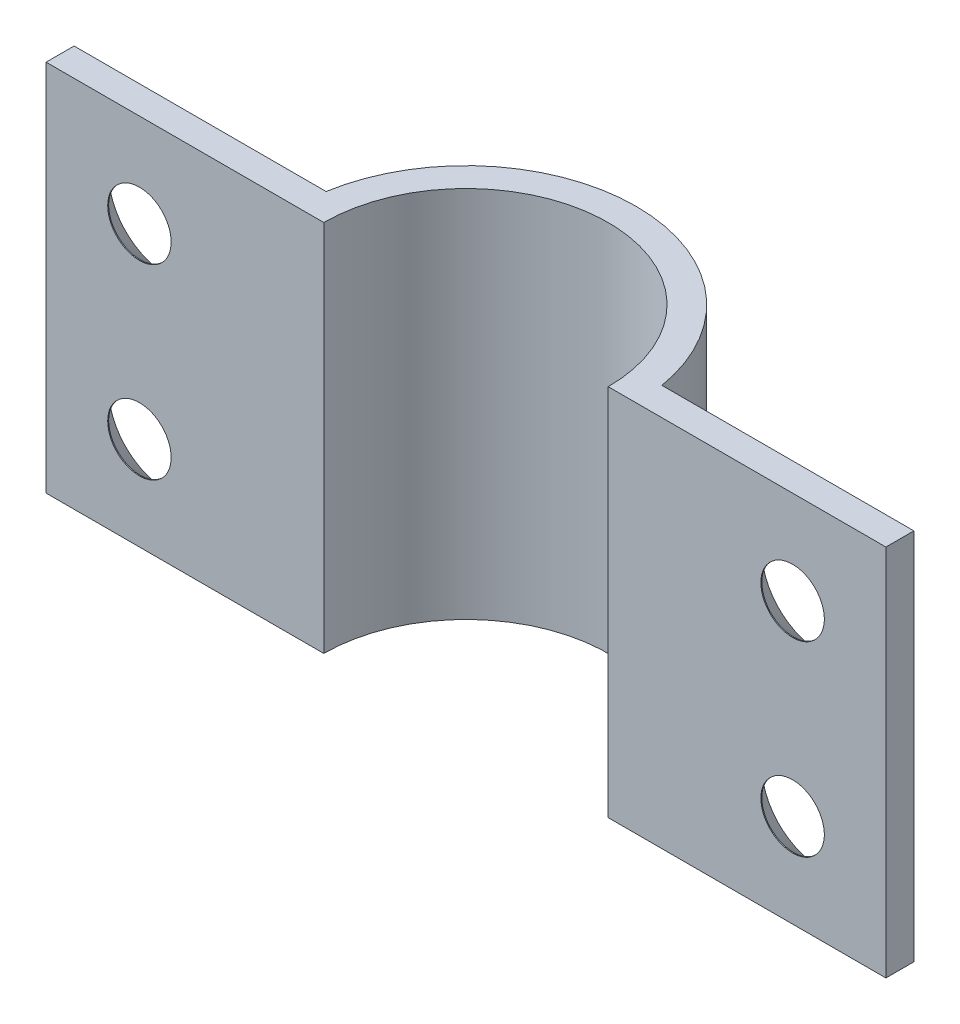
ISO-10303-21;
HEADER;
FILE_DESCRIPTION(('STEP AP214'),'2;1');
FILE_NAME('part.step','',(''),(''),'','','');
FILE_SCHEMA(('AUTOMOTIVE_DESIGN { 1 0 10303 214 1 1 1 1 }'));
ENDSEC;
DATA;
#1=APPLICATION_CONTEXT('core data for automotive mechanical design processes');
#2=APPLICATION_PROTOCOL_DEFINITION('international standard','automotive_design',2000,#1);
#3=PRODUCT_CONTEXT('',#1,'mechanical');
#4=PRODUCT('Part','Part','',(#3));
#5=PRODUCT_RELATED_PRODUCT_CATEGORY('part','',(#4));
#6=PRODUCT_DEFINITION_FORMATION('','',#4);
#7=PRODUCT_DEFINITION_CONTEXT('part definition',#1,'design');
#8=PRODUCT_DEFINITION('design','',#6,#7);
#9=PRODUCT_DEFINITION_SHAPE('','',#8);
#10=(LENGTH_UNIT() NAMED_UNIT(*) SI_UNIT(.MILLI.,.METRE.));
#11=(NAMED_UNIT(*) PLANE_ANGLE_UNIT() SI_UNIT($,.RADIAN.));
#12=(NAMED_UNIT(*) SI_UNIT($,.STERADIAN.) SOLID_ANGLE_UNIT());
#13=UNCERTAINTY_MEASURE_WITH_UNIT(LENGTH_MEASURE(1.E-05),#10,'distance_accuracy_value','');
#14=(GEOMETRIC_REPRESENTATION_CONTEXT(3) GLOBAL_UNCERTAINTY_ASSIGNED_CONTEXT((#13)) GLOBAL_UNIT_ASSIGNED_CONTEXT((#10,
#11,#12)) REPRESENTATION_CONTEXT('',''));
#15=CARTESIAN_POINT('',(0.,0.,0.));
#16=DIRECTION('',(0.,0.,1.));
#17=DIRECTION('',(1.,0.,0.));
#18=AXIS2_PLACEMENT_3D('',#15,#16,#17);
#19=CARTESIAN_POINT('',(0.,20.,0.));
#20=DIRECTION('',(0.,-1.,0.));
#21=DIRECTION('',(0.,0.,-1.));
#22=AXIS2_PLACEMENT_3D('',#19,#20,#21);
#23=CYLINDRICAL_SURFACE('',#22,9.12);
#24=CARTESIAN_POINT('',(0.,0.,0.));
#25=DIRECTION('',(0.,1.,0.));
#26=DIRECTION('',(0.,0.,1.));
#27=AXIS2_PLACEMENT_3D('',#24,#25,#26);
#28=CIRCLE('',#27,9.12);
#29=CARTESIAN_POINT('',(8.9957990195424,0.,-1.5));
#30=VERTEX_POINT('',#29);
#31=CARTESIAN_POINT('',(-8.9957990195424,0.,-1.5));
#32=VERTEX_POINT('',#31);
#33=EDGE_CURVE('E140',#30,#32,#28,.T.);
#34=ORIENTED_EDGE('',*,*,#33,.T.);
#35=DIRECTION('',(0.,-1.,0.));
#36=VECTOR('',#35,1.);
#37=CARTESIAN_POINT('',(-8.9957990195424,20.,-1.5));
#38=LINE('',#37,#36);
#39=CARTESIAN_POINT('',(-8.9957990195424,20.,-1.5));
#40=VERTEX_POINT('',#39);
#41=EDGE_CURVE('E11',#40,#32,#38,.T.);
#42=ORIENTED_EDGE('',*,*,#41,.F.);
#43=CARTESIAN_POINT('',(0.,20.,0.));
#44=DIRECTION('',(0.,1.,0.));
#45=DIRECTION('',(0.,0.,1.));
#46=AXIS2_PLACEMENT_3D('',#43,#44,#45);
#47=CIRCLE('',#46,9.12);
#48=CARTESIAN_POINT('',(8.9957990195424,20.,-1.5));
#49=VERTEX_POINT('',#48);
#50=EDGE_CURVE('E163',#49,#40,#47,.T.);
#51=ORIENTED_EDGE('',*,*,#50,.F.);
#52=DIRECTION('',(0.,-1.,0.));
#53=VECTOR('',#52,1.);
#54=CARTESIAN_POINT('',(8.9957990195424,20.,-1.5));
#55=LINE('',#54,#53);
#56=EDGE_CURVE('E136',#49,#30,#55,.T.);
#57=ORIENTED_EDGE('',*,*,#56,.T.);
#58=EDGE_LOOP('',(#34,#42,#51,#57));
#59=FACE_BOUND('',#58,.T.);
#60=ADVANCED_FACE('F39',(#59),#23,.T.);
#61=CARTESIAN_POINT('',(-8.9957990195424,20.,-1.5));
#62=DIRECTION('',(0.,0.,1.));
#63=DIRECTION('',(1.,0.,0.));
#64=AXIS2_PLACEMENT_3D('',#61,#62,#63);
#65=PLANE('',#64);
#66=CARTESIAN_POINT('',(-17.5,5.,-1.5));
#67=DIRECTION('',(0.,0.,-1.));
#68=DIRECTION('',(-1.,0.,0.));
#69=AXIS2_PLACEMENT_3D('',#66,#67,#68);
#70=CIRCLE('',#69,3.15);
#71=CARTESIAN_POINT('',(-20.65,5.,-1.5));
#72=VERTEX_POINT('',#71);
#73=EDGE_CURVE('E238',#72,#72,#70,.T.);
#74=ORIENTED_EDGE('',*,*,#73,.F.);
#75=EDGE_LOOP('',(#74));
#76=FACE_BOUND('',#75,.T.);
#77=CARTESIAN_POINT('',(-17.5,15.,-1.5));
#78=DIRECTION('',(0.,0.,-1.));
#79=DIRECTION('',(-1.,0.,0.));
#80=AXIS2_PLACEMENT_3D('',#77,#78,#79);
#81=CIRCLE('',#80,3.15);
#82=CARTESIAN_POINT('',(-20.65,15.,-1.5));
#83=VERTEX_POINT('',#82);
#84=EDGE_CURVE('E214',#83,#83,#81,.T.);
#85=ORIENTED_EDGE('',*,*,#84,.F.);
#86=EDGE_LOOP('',(#85));
#87=FACE_BOUND('',#86,.T.);
#88=DIRECTION('',(-1.,0.,0.));
#89=VECTOR('',#88,1.);
#90=CARTESIAN_POINT('',(-8.9957990195424,0.,-1.5));
#91=LINE('',#90,#89);
#92=CARTESIAN_POINT('',(-22.5,0.,-1.5));
#93=VERTEX_POINT('',#92);
#94=EDGE_CURVE('E144',#32,#93,#91,.T.);
#95=ORIENTED_EDGE('',*,*,#94,.T.);
#96=DIRECTION('',(0.,-1.,0.));
#97=VECTOR('',#96,1.);
#98=CARTESIAN_POINT('',(-22.5,20.,-1.5));
#99=LINE('',#98,#97);
#100=CARTESIAN_POINT('',(-22.5,20.,-1.5));
#101=VERTEX_POINT('',#100);
#102=EDGE_CURVE('E48',#101,#93,#99,.T.);
#103=ORIENTED_EDGE('',*,*,#102,.F.);
#104=DIRECTION('',(-1.,0.,0.));
#105=VECTOR('',#104,1.);
#106=CARTESIAN_POINT('',(-8.9957990195424,20.,-1.5));
#107=LINE('',#106,#105);
#108=EDGE_CURVE('E99',#40,#101,#107,.T.);
#109=ORIENTED_EDGE('',*,*,#108,.F.);
#110=ORIENTED_EDGE('',*,*,#41,.T.);
#111=EDGE_LOOP('',(#95,#103,#109,#110));
#112=FACE_BOUND('',#111,.T.);
#113=ADVANCED_FACE('F281',(#76,#87,#112),#65,.F.);
#114=CARTESIAN_POINT('',(-22.5,20.,-1.5));
#115=DIRECTION('',(1.,0.,0.));
#116=DIRECTION('',(0.,0.,-1.));
#117=AXIS2_PLACEMENT_3D('',#114,#115,#116);
#118=PLANE('',#117);
#119=DIRECTION('',(0.,0.,1.));
#120=VECTOR('',#119,1.);
#121=CARTESIAN_POINT('',(-22.5,0.,-1.5));
#122=LINE('',#121,#120);
#123=CARTESIAN_POINT('',(-22.5,0.,0.));
#124=VERTEX_POINT('',#123);
#125=EDGE_CURVE('E148',#93,#124,#122,.T.);
#126=ORIENTED_EDGE('',*,*,#125,.T.);
#127=DIRECTION('',(0.,-1.,0.));
#128=VECTOR('',#127,1.);
#129=CARTESIAN_POINT('',(-22.5,20.,0.));
#130=LINE('',#129,#128);
#131=CARTESIAN_POINT('',(-22.5,20.,0.));
#132=VERTEX_POINT('',#131);
#133=EDGE_CURVE('E174',#132,#124,#130,.T.);
#134=ORIENTED_EDGE('',*,*,#133,.F.);
#135=DIRECTION('',(0.,0.,1.));
#136=VECTOR('',#135,1.);
#137=CARTESIAN_POINT('',(-22.5,20.,-1.5));
#138=LINE('',#137,#136);
#139=EDGE_CURVE('E184',#101,#132,#138,.T.);
#140=ORIENTED_EDGE('',*,*,#139,.F.);
#141=ORIENTED_EDGE('',*,*,#102,.T.);
#142=EDGE_LOOP('',(#126,#134,#140,#141));
#143=FACE_BOUND('',#142,.T.);
#144=ADVANCED_FACE('F182',(#143),#118,.F.);
#145=CARTESIAN_POINT('',(-7.62,20.,0.));
#146=DIRECTION('',(0.,0.,-1.));
#147=DIRECTION('',(-1.,0.,0.));
#148=AXIS2_PLACEMENT_3D('',#145,#146,#147);
#149=PLANE('',#148);
#150=CARTESIAN_POINT('',(-17.5,5.,0.));
#151=DIRECTION('',(0.,0.,-1.));
#152=DIRECTION('',(-1.,0.,0.));
#153=AXIS2_PLACEMENT_3D('',#150,#151,#152);
#154=CIRCLE('',#153,1.7);
#155=CARTESIAN_POINT('',(-19.2,5.,0.));
#156=VERTEX_POINT('',#155);
#157=EDGE_CURVE('E230',#156,#156,#154,.T.);
#158=ORIENTED_EDGE('',*,*,#157,.T.);
#159=EDGE_LOOP('',(#158));
#160=FACE_BOUND('',#159,.T.);
#161=CARTESIAN_POINT('',(-17.5,15.,0.));
#162=DIRECTION('',(0.,0.,-1.));
#163=DIRECTION('',(-1.,0.,0.));
#164=AXIS2_PLACEMENT_3D('',#161,#162,#163);
#165=CIRCLE('',#164,1.7);
#166=CARTESIAN_POINT('',(-19.2,15.,0.));
#167=VERTEX_POINT('',#166);
#168=EDGE_CURVE('E145',#167,#167,#165,.T.);
#169=ORIENTED_EDGE('',*,*,#168,.T.);
#170=EDGE_LOOP('',(#169));
#171=FACE_BOUND('',#170,.T.);
#172=DIRECTION('',(1.,0.,0.));
#173=VECTOR('',#172,1.);
#174=CARTESIAN_POINT('',(-7.62,0.,0.));
#175=LINE('',#174,#173);
#176=CARTESIAN_POINT('',(-7.62,0.,0.));
#177=VERTEX_POINT('',#176);
#178=EDGE_CURVE('E151',#124,#177,#175,.T.);
#179=ORIENTED_EDGE('',*,*,#178,.T.);
#180=DIRECTION('',(0.,-1.,0.));
#181=VECTOR('',#180,1.);
#182=CARTESIAN_POINT('',(-7.62,20.,0.));
#183=LINE('',#182,#181);
#184=CARTESIAN_POINT('',(-7.62,20.,0.));
#185=VERTEX_POINT('',#184);
#186=EDGE_CURVE('E170',#185,#177,#183,.T.);
#187=ORIENTED_EDGE('',*,*,#186,.F.);
#188=DIRECTION('',(1.,0.,0.));
#189=VECTOR('',#188,1.);
#190=CARTESIAN_POINT('',(-7.62,20.,0.));
#191=LINE('',#190,#189);
#192=EDGE_CURVE('E197',#132,#185,#191,.T.);
#193=ORIENTED_EDGE('',*,*,#192,.F.);
#194=ORIENTED_EDGE('',*,*,#133,.T.);
#195=EDGE_LOOP('',(#179,#187,#193,#194));
#196=FACE_BOUND('',#195,.T.);
#197=ADVANCED_FACE('F192',(#160,#171,#196),#149,.F.);
#198=CARTESIAN_POINT('',(0.,20.,0.));
#199=DIRECTION('',(0.,-1.,0.));
#200=DIRECTION('',(0.,0.,-1.));
#201=AXIS2_PLACEMENT_3D('',#198,#199,#200);
#202=CYLINDRICAL_SURFACE('',#201,7.62);
#203=CARTESIAN_POINT('',(0.,0.,0.));
#204=DIRECTION('',(0.,-1.,0.));
#205=DIRECTION('',(0.,0.,1.));
#206=AXIS2_PLACEMENT_3D('',#203,#204,#205);
#207=CIRCLE('',#206,7.62);
#208=CARTESIAN_POINT('',(7.62,0.,0.));
#209=VERTEX_POINT('',#208);
#210=EDGE_CURVE('E154',#177,#209,#207,.T.);
#211=ORIENTED_EDGE('',*,*,#210,.T.);
#212=DIRECTION('',(0.,-1.,0.));
#213=VECTOR('',#212,1.);
#214=CARTESIAN_POINT('',(7.62,20.,0.));
#215=LINE('',#214,#213);
#216=CARTESIAN_POINT('',(7.62,20.,0.));
#217=VERTEX_POINT('',#216);
#218=EDGE_CURVE('E129',#217,#209,#215,.T.);
#219=ORIENTED_EDGE('',*,*,#218,.F.);
#220=CARTESIAN_POINT('',(0.,20.,0.));
#221=DIRECTION('',(0.,-1.,0.));
#222=DIRECTION('',(0.,0.,1.));
#223=AXIS2_PLACEMENT_3D('',#220,#221,#222);
#224=CIRCLE('',#223,7.62);
#225=EDGE_CURVE('E118',#185,#217,#224,.T.);
#226=ORIENTED_EDGE('',*,*,#225,.F.);
#227=ORIENTED_EDGE('',*,*,#186,.T.);
#228=EDGE_LOOP('',(#211,#219,#226,#227));
#229=FACE_BOUND('',#228,.T.);
#230=ADVANCED_FACE('F195',(#229),#202,.F.);
#231=CARTESIAN_POINT('',(7.62,20.,0.));
#232=DIRECTION('',(0.,0.,-1.));
#233=DIRECTION('',(-1.,0.,0.));
#234=AXIS2_PLACEMENT_3D('',#231,#232,#233);
#235=PLANE('',#234);
#236=CARTESIAN_POINT('',(17.5,5.,0.));
#237=DIRECTION('',(0.,0.,-1.));
#238=DIRECTION('',(-1.,0.,0.));
#239=AXIS2_PLACEMENT_3D('',#236,#237,#238);
#240=CIRCLE('',#239,1.7);
#241=CARTESIAN_POINT('',(15.8,5.,0.));
#242=VERTEX_POINT('',#241);
#243=EDGE_CURVE('E242',#242,#242,#240,.T.);
#244=ORIENTED_EDGE('',*,*,#243,.T.);
#245=EDGE_LOOP('',(#244));
#246=FACE_BOUND('',#245,.T.);
#247=CARTESIAN_POINT('',(17.5,15.,0.));
#248=DIRECTION('',(0.,0.,-1.));
#249=DIRECTION('',(-1.,0.,0.));
#250=AXIS2_PLACEMENT_3D('',#247,#248,#249);
#251=CIRCLE('',#250,1.7);
#252=CARTESIAN_POINT('',(15.8,15.,0.));
#253=VERTEX_POINT('',#252);
#254=EDGE_CURVE('E218',#253,#253,#251,.T.);
#255=ORIENTED_EDGE('',*,*,#254,.T.);
#256=EDGE_LOOP('',(#255));
#257=FACE_BOUND('',#256,.T.);
#258=DIRECTION('',(1.,0.,0.));
#259=VECTOR('',#258,1.);
#260=CARTESIAN_POINT('',(7.62,0.,0.));
#261=LINE('',#260,#259);
#262=CARTESIAN_POINT('',(22.5,0.,0.));
#263=VERTEX_POINT('',#262);
#264=EDGE_CURVE('E127',#209,#263,#261,.T.);
#265=ORIENTED_EDGE('',*,*,#264,.T.);
#266=DIRECTION('',(0.,-1.,0.));
#267=VECTOR('',#266,1.);
#268=CARTESIAN_POINT('',(22.5,20.,0.));
#269=LINE('',#268,#267);
#270=CARTESIAN_POINT('',(22.5,20.,0.));
#271=VERTEX_POINT('',#270);
#272=EDGE_CURVE('E124',#271,#263,#269,.T.);
#273=ORIENTED_EDGE('',*,*,#272,.F.);
#274=DIRECTION('',(1.,0.,0.));
#275=VECTOR('',#274,1.);
#276=CARTESIAN_POINT('',(7.62,20.,0.));
#277=LINE('',#276,#275);
#278=EDGE_CURVE('E112',#217,#271,#277,.T.);
#279=ORIENTED_EDGE('',*,*,#278,.F.);
#280=ORIENTED_EDGE('',*,*,#218,.T.);
#281=EDGE_LOOP('',(#265,#273,#279,#280));
#282=FACE_BOUND('',#281,.T.);
#283=ADVANCED_FACE('F125',(#246,#257,#282),#235,.F.);
#284=CARTESIAN_POINT('',(22.5,20.,-1.5));
#285=DIRECTION('',(-1.,0.,0.));
#286=DIRECTION('',(0.,0.,1.));
#287=AXIS2_PLACEMENT_3D('',#284,#285,#286);
#288=PLANE('',#287);
#289=DIRECTION('',(0.,0.,-1.));
#290=VECTOR('',#289,1.);
#291=CARTESIAN_POINT('',(22.5,0.,-1.5));
#292=LINE('',#291,#290);
#293=CARTESIAN_POINT('',(22.5,0.,-1.5));
#294=VERTEX_POINT('',#293);
#295=EDGE_CURVE('E85',#263,#294,#292,.T.);
#296=ORIENTED_EDGE('',*,*,#295,.T.);
#297=DIRECTION('',(0.,-1.,0.));
#298=VECTOR('',#297,1.);
#299=CARTESIAN_POINT('',(22.5,20.,-1.5));
#300=LINE('',#299,#298);
#301=CARTESIAN_POINT('',(22.5,20.,-1.5));
#302=VERTEX_POINT('',#301);
#303=EDGE_CURVE('E130',#302,#294,#300,.T.);
#304=ORIENTED_EDGE('',*,*,#303,.F.);
#305=DIRECTION('',(0.,0.,-1.));
#306=VECTOR('',#305,1.);
#307=CARTESIAN_POINT('',(22.5,20.,-1.5));
#308=LINE('',#307,#306);
#309=EDGE_CURVE('E116',#271,#302,#308,.T.);
#310=ORIENTED_EDGE('',*,*,#309,.F.);
#311=ORIENTED_EDGE('',*,*,#272,.T.);
#312=EDGE_LOOP('',(#296,#304,#310,#311));
#313=FACE_BOUND('',#312,.T.);
#314=ADVANCED_FACE('F132',(#313),#288,.F.);
#315=CARTESIAN_POINT('',(8.9957990195424,20.,-1.5));
#316=DIRECTION('',(0.,0.,1.));
#317=DIRECTION('',(1.,0.,0.));
#318=AXIS2_PLACEMENT_3D('',#315,#316,#317);
#319=PLANE('',#318);
#320=CARTESIAN_POINT('',(17.5,5.,-1.5));
#321=DIRECTION('',(0.,0.,-1.));
#322=DIRECTION('',(-1.,0.,0.));
#323=AXIS2_PLACEMENT_3D('',#320,#321,#322);
#324=CIRCLE('',#323,3.15);
#325=CARTESIAN_POINT('',(14.35,5.,-1.5));
#326=VERTEX_POINT('',#325);
#327=EDGE_CURVE('E250',#326,#326,#324,.T.);
#328=ORIENTED_EDGE('',*,*,#327,.F.);
#329=EDGE_LOOP('',(#328));
#330=FACE_BOUND('',#329,.T.);
#331=CARTESIAN_POINT('',(17.5,15.,-1.5));
#332=DIRECTION('',(0.,0.,-1.));
#333=DIRECTION('',(-1.,0.,0.));
#334=AXIS2_PLACEMENT_3D('',#331,#332,#333);
#335=CIRCLE('',#334,3.15);
#336=CARTESIAN_POINT('',(14.35,15.,-1.5));
#337=VERTEX_POINT('',#336);
#338=EDGE_CURVE('E226',#337,#337,#335,.T.);
#339=ORIENTED_EDGE('',*,*,#338,.F.);
#340=EDGE_LOOP('',(#339));
#341=FACE_BOUND('',#340,.T.);
#342=DIRECTION('',(-1.,0.,0.));
#343=VECTOR('',#342,1.);
#344=CARTESIAN_POINT('',(8.9957990195424,0.,-1.5));
#345=LINE('',#344,#343);
#346=EDGE_CURVE('E91',#294,#30,#345,.T.);
#347=ORIENTED_EDGE('',*,*,#346,.T.);
#348=ORIENTED_EDGE('',*,*,#56,.F.);
#349=DIRECTION('',(-1.,0.,0.));
#350=VECTOR('',#349,1.);
#351=CARTESIAN_POINT('',(8.9957990195424,20.,-1.5));
#352=LINE('',#351,#350);
#353=EDGE_CURVE('E56',#302,#49,#352,.T.);
#354=ORIENTED_EDGE('',*,*,#353,.F.);
#355=ORIENTED_EDGE('',*,*,#303,.T.);
#356=EDGE_LOOP('',(#347,#348,#354,#355));
#357=FACE_BOUND('',#356,.T.);
#358=ADVANCED_FACE('F257',(#330,#341,#357),#319,.F.);
#359=CARTESIAN_POINT('',(0.,20.,0.));
#360=DIRECTION('',(0.,1.,0.));
#361=DIRECTION('',(0.,0.,1.));
#362=AXIS2_PLACEMENT_3D('',#359,#360,#361);
#363=PLANE('',#362);
#364=ORIENTED_EDGE('',*,*,#50,.T.);
#365=ORIENTED_EDGE('',*,*,#108,.T.);
#366=ORIENTED_EDGE('',*,*,#139,.T.);
#367=ORIENTED_EDGE('',*,*,#192,.T.);
#368=ORIENTED_EDGE('',*,*,#225,.T.);
#369=ORIENTED_EDGE('',*,*,#278,.T.);
#370=ORIENTED_EDGE('',*,*,#309,.T.);
#371=ORIENTED_EDGE('',*,*,#353,.T.);
#372=EDGE_LOOP('',(#364,#365,#366,#367,#368,#369,#370,#371));
#373=FACE_BOUND('',#372,.T.);
#374=ADVANCED_FACE('F114',(#373),#363,.T.);
#375=CARTESIAN_POINT('',(0.,0.,0.));
#376=DIRECTION('',(0.,1.,0.));
#377=DIRECTION('',(0.,0.,1.));
#378=AXIS2_PLACEMENT_3D('',#375,#376,#377);
#379=PLANE('',#378);
#380=ORIENTED_EDGE('',*,*,#33,.F.);
#381=ORIENTED_EDGE('',*,*,#346,.F.);
#382=ORIENTED_EDGE('',*,*,#295,.F.);
#383=ORIENTED_EDGE('',*,*,#264,.F.);
#384=ORIENTED_EDGE('',*,*,#210,.F.);
#385=ORIENTED_EDGE('',*,*,#178,.F.);
#386=ORIENTED_EDGE('',*,*,#125,.F.);
#387=ORIENTED_EDGE('',*,*,#94,.F.);
#388=EDGE_LOOP('',(#380,#381,#382,#383,#384,#385,#386,#387));
#389=FACE_BOUND('',#388,.T.);
#390=ADVANCED_FACE('F188',(#389),#379,.F.);
#391=CARTESIAN_POINT('',(-17.5,15.,-1.5));
#392=DIRECTION('',(0.,0.,-1.));
#393=DIRECTION('',(-1.,0.,0.));
#394=AXIS2_PLACEMENT_3D('',#391,#392,#393);
#395=CYLINDRICAL_SURFACE('',#394,1.69999999999999);
#396=ORIENTED_EDGE('',*,*,#168,.F.);
#397=EDGE_LOOP('',(#396));
#398=FACE_BOUND('',#397,.T.);
#399=CARTESIAN_POINT('',(-17.5,15.,-0.0499999999999932));
#400=DIRECTION('',(0.,0.,-1.));
#401=DIRECTION('',(-1.,0.,0.));
#402=AXIS2_PLACEMENT_3D('',#399,#400,#401);
#403=CIRCLE('',#402,1.69999999999999);
#404=CARTESIAN_POINT('',(-19.2,15.,-0.0499999999999932));
#405=VERTEX_POINT('',#404);
#406=EDGE_CURVE('E210',#405,#405,#403,.T.);
#407=ORIENTED_EDGE('',*,*,#406,.T.);
#408=EDGE_LOOP('',(#407));
#409=FACE_BOUND('',#408,.T.);
#410=ADVANCED_FACE('F308',(#398,#409),#395,.F.);
#411=CARTESIAN_POINT('',(-17.5,15.,-1.5));
#412=DIRECTION('',(0.,0.,-1.));
#413=DIRECTION('',(-1.,0.,0.));
#414=AXIS2_PLACEMENT_3D('',#411,#412,#413);
#415=CONICAL_SURFACE('',#414,3.15,0.785398163397449);
#416=ORIENTED_EDGE('',*,*,#406,.F.);
#417=EDGE_LOOP('',(#416));
#418=FACE_BOUND('',#417,.T.);
#419=ORIENTED_EDGE('',*,*,#84,.T.);
#420=EDGE_LOOP('',(#419));
#421=FACE_BOUND('',#420,.T.);
#422=ADVANCED_FACE('F276',(#418,#421),#415,.F.);
#423=CARTESIAN_POINT('',(17.5,15.,-1.5));
#424=DIRECTION('',(0.,0.,-1.));
#425=DIRECTION('',(-1.,0.,0.));
#426=AXIS2_PLACEMENT_3D('',#423,#424,#425);
#427=CYLINDRICAL_SURFACE('',#426,1.69999999999999);
#428=ORIENTED_EDGE('',*,*,#254,.F.);
#429=EDGE_LOOP('',(#428));
#430=FACE_BOUND('',#429,.T.);
#431=CARTESIAN_POINT('',(17.5,15.,-0.0499999999999932));
#432=DIRECTION('',(0.,0.,-1.));
#433=DIRECTION('',(-1.,0.,0.));
#434=AXIS2_PLACEMENT_3D('',#431,#432,#433);
#435=CIRCLE('',#434,1.69999999999999);
#436=CARTESIAN_POINT('',(15.8,15.,-0.0499999999999932));
#437=VERTEX_POINT('',#436);
#438=EDGE_CURVE('E222',#437,#437,#435,.T.);
#439=ORIENTED_EDGE('',*,*,#438,.T.);
#440=EDGE_LOOP('',(#439));
#441=FACE_BOUND('',#440,.T.);
#442=ADVANCED_FACE('F266',(#430,#441),#427,.F.);
#443=CARTESIAN_POINT('',(17.5,15.,-1.5));
#444=DIRECTION('',(0.,0.,-1.));
#445=DIRECTION('',(-1.,0.,0.));
#446=AXIS2_PLACEMENT_3D('',#443,#444,#445);
#447=CONICAL_SURFACE('',#446,3.15,0.785398163397449);
#448=ORIENTED_EDGE('',*,*,#438,.F.);
#449=EDGE_LOOP('',(#448));
#450=FACE_BOUND('',#449,.T.);
#451=ORIENTED_EDGE('',*,*,#338,.T.);
#452=EDGE_LOOP('',(#451));
#453=FACE_BOUND('',#452,.T.);
#454=ADVANCED_FACE('F263',(#450,#453),#447,.F.);
#455=CARTESIAN_POINT('',(-17.5,5.,-1.5));
#456=DIRECTION('',(0.,0.,-1.));
#457=DIRECTION('',(-1.,0.,0.));
#458=AXIS2_PLACEMENT_3D('',#455,#456,#457);
#459=CYLINDRICAL_SURFACE('',#458,1.69999999999999);
#460=ORIENTED_EDGE('',*,*,#157,.F.);
#461=EDGE_LOOP('',(#460));
#462=FACE_BOUND('',#461,.T.);
#463=CARTESIAN_POINT('',(-17.5,5.,-0.0499999999999932));
#464=DIRECTION('',(0.,0.,-1.));
#465=DIRECTION('',(-1.,0.,0.));
#466=AXIS2_PLACEMENT_3D('',#463,#464,#465);
#467=CIRCLE('',#466,1.69999999999999);
#468=CARTESIAN_POINT('',(-19.2,5.,-0.0499999999999932));
#469=VERTEX_POINT('',#468);
#470=EDGE_CURVE('E234',#469,#469,#467,.T.);
#471=ORIENTED_EDGE('',*,*,#470,.T.);
#472=EDGE_LOOP('',(#471));
#473=FACE_BOUND('',#472,.T.);
#474=ADVANCED_FACE('F265',(#462,#473),#459,.F.);
#475=CARTESIAN_POINT('',(-17.5,5.,-1.5));
#476=DIRECTION('',(0.,0.,-1.));
#477=DIRECTION('',(-1.,0.,0.));
#478=AXIS2_PLACEMENT_3D('',#475,#476,#477);
#479=CONICAL_SURFACE('',#478,3.15,0.785398163397449);
#480=ORIENTED_EDGE('',*,*,#470,.F.);
#481=EDGE_LOOP('',(#480));
#482=FACE_BOUND('',#481,.T.);
#483=ORIENTED_EDGE('',*,*,#73,.T.);
#484=EDGE_LOOP('',(#483));
#485=FACE_BOUND('',#484,.T.);
#486=ADVANCED_FACE('F273',(#482,#485),#479,.F.);
#487=CARTESIAN_POINT('',(17.5,5.,-1.5));
#488=DIRECTION('',(0.,0.,-1.));
#489=DIRECTION('',(-1.,0.,0.));
#490=AXIS2_PLACEMENT_3D('',#487,#488,#489);
#491=CYLINDRICAL_SURFACE('',#490,1.69999999999999);
#492=ORIENTED_EDGE('',*,*,#243,.F.);
#493=EDGE_LOOP('',(#492));
#494=FACE_BOUND('',#493,.T.);
#495=CARTESIAN_POINT('',(17.5,5.,-0.0499999999999932));
#496=DIRECTION('',(0.,0.,-1.));
#497=DIRECTION('',(-1.,0.,0.));
#498=AXIS2_PLACEMENT_3D('',#495,#496,#497);
#499=CIRCLE('',#498,1.69999999999999);
#500=CARTESIAN_POINT('',(15.8,5.,-0.0499999999999932));
#501=VERTEX_POINT('',#500);
#502=EDGE_CURVE('E246',#501,#501,#499,.T.);
#503=ORIENTED_EDGE('',*,*,#502,.T.);
#504=EDGE_LOOP('',(#503));
#505=FACE_BOUND('',#504,.T.);
#506=ADVANCED_FACE('F347',(#494,#505),#491,.F.);
#507=CARTESIAN_POINT('',(17.5,5.,-1.5));
#508=DIRECTION('',(0.,0.,-1.));
#509=DIRECTION('',(-1.,0.,0.));
#510=AXIS2_PLACEMENT_3D('',#507,#508,#509);
#511=CONICAL_SURFACE('',#510,3.15,0.785398163397449);
#512=ORIENTED_EDGE('',*,*,#502,.F.);
#513=EDGE_LOOP('',(#512));
#514=FACE_BOUND('',#513,.T.);
#515=ORIENTED_EDGE('',*,*,#327,.T.);
#516=EDGE_LOOP('',(#515));
#517=FACE_BOUND('',#516,.T.);
#518=ADVANCED_FACE('F255',(#514,#517),#511,.F.);
#519=CLOSED_SHELL('',(#60,#113,#144,#197,#230,#283,#314,#358,#374,#390,#410,#422,#442,#454,#474,
#486,#506,#518));
#520=MANIFOLD_SOLID_BREP('B2',#519);
#521=ADVANCED_BREP_SHAPE_REPRESENTATION('',(#18,#520),#14);
#522=SHAPE_DEFINITION_REPRESENTATION(#9,#521);
ENDSEC;
END-ISO-10303-21;
